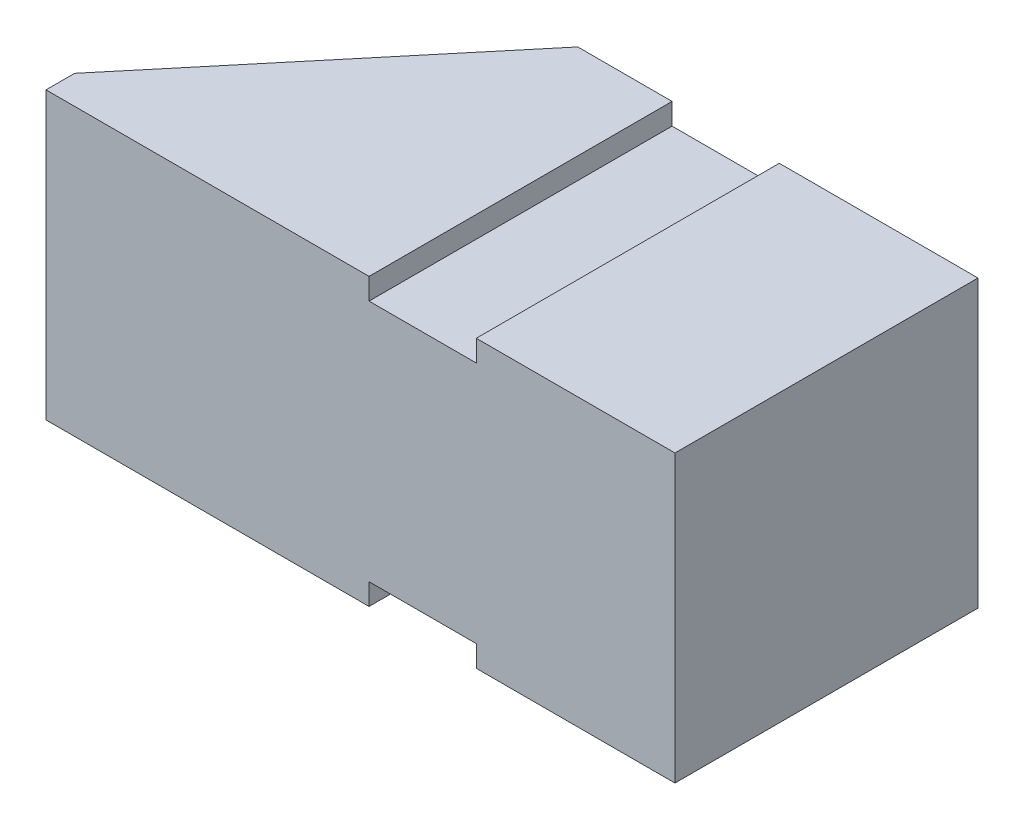
ISO-10303-21;
HEADER;
FILE_DESCRIPTION(('STEP AP214'),'2;1');
FILE_NAME('part.step','',(''),(''),'','','');
FILE_SCHEMA(('AUTOMOTIVE_DESIGN { 1 0 10303 214 1 1 1 1 }'));
ENDSEC;
DATA;
#1=APPLICATION_CONTEXT('core data for automotive mechanical design processes');
#2=APPLICATION_PROTOCOL_DEFINITION('international standard','automotive_design',2000,#1);
#3=PRODUCT_CONTEXT('',#1,'mechanical');
#4=PRODUCT('Part','Part','',(#3));
#5=PRODUCT_RELATED_PRODUCT_CATEGORY('part','',(#4));
#6=PRODUCT_DEFINITION_FORMATION('','',#4);
#7=PRODUCT_DEFINITION_CONTEXT('part definition',#1,'design');
#8=PRODUCT_DEFINITION('design','',#6,#7);
#9=PRODUCT_DEFINITION_SHAPE('','',#8);
#10=(LENGTH_UNIT() NAMED_UNIT(*) SI_UNIT(.MILLI.,.METRE.));
#11=(NAMED_UNIT(*) PLANE_ANGLE_UNIT() SI_UNIT($,.RADIAN.));
#12=(NAMED_UNIT(*) SI_UNIT($,.STERADIAN.) SOLID_ANGLE_UNIT());
#13=UNCERTAINTY_MEASURE_WITH_UNIT(LENGTH_MEASURE(1.E-05),#10,'distance_accuracy_value','');
#14=(GEOMETRIC_REPRESENTATION_CONTEXT(3) GLOBAL_UNCERTAINTY_ASSIGNED_CONTEXT((#13)) GLOBAL_UNIT_ASSIGNED_CONTEXT((#10,
#11,#12)) REPRESENTATION_CONTEXT('',''));
#15=CARTESIAN_POINT('',(0.,0.,0.));
#16=DIRECTION('',(0.,0.,1.));
#17=DIRECTION('',(1.,0.,0.));
#18=AXIS2_PLACEMENT_3D('',#15,#16,#17);
#19=CARTESIAN_POINT('',(-22.,10.,21.2));
#20=DIRECTION('',(0.,-1.,0.));
#21=DIRECTION('',(1.,0.,0.));
#22=AXIS2_PLACEMENT_3D('',#19,#20,#21);
#23=PLANE('',#22);
#24=DIRECTION('',(0.,0.,-1.));
#25=VECTOR('',#24,1.);
#26=CARTESIAN_POINT('',(8.1,10.,21.2));
#27=LINE('',#26,#25);
#28=CARTESIAN_POINT('',(8.1,10.,21.2));
#29=VERTEX_POINT('',#28);
#30=CARTESIAN_POINT('',(8.1,10.,0.));
#31=VERTEX_POINT('',#30);
#32=EDGE_CURVE('E192',#29,#31,#27,.T.);
#33=ORIENTED_EDGE('',*,*,#32,.F.);
#34=DIRECTION('',(-1.,0.,0.));
#35=VECTOR('',#34,1.);
#36=CARTESIAN_POINT('',(-22.,10.,21.2));
#37=LINE('',#36,#35);
#38=CARTESIAN_POINT('',(22.,10.,21.2));
#39=VERTEX_POINT('',#38);
#40=EDGE_CURVE('E181',#39,#29,#37,.T.);
#41=ORIENTED_EDGE('',*,*,#40,.F.);
#42=DIRECTION('',(0.,0.,-1.));
#43=VECTOR('',#42,1.);
#44=CARTESIAN_POINT('',(22.,10.,21.2));
#45=LINE('',#44,#43);
#46=CARTESIAN_POINT('',(22.,10.,0.));
#47=VERTEX_POINT('',#46);
#48=EDGE_CURVE('E270',#39,#47,#45,.T.);
#49=ORIENTED_EDGE('',*,*,#48,.T.);
#50=DIRECTION('',(-1.,0.,0.));
#51=VECTOR('',#50,1.);
#52=CARTESIAN_POINT('',(-22.,10.,0.));
#53=LINE('',#52,#51);
#54=EDGE_CURVE('E256',#47,#31,#53,.T.);
#55=ORIENTED_EDGE('',*,*,#54,.T.);
#56=EDGE_LOOP('',(#33,#41,#49,#55));
#57=FACE_BOUND('',#56,.T.);
#58=ADVANCED_FACE('F43',(#57),#23,.F.);
#59=DIRECTION('',(0.,0.,-1.));
#60=VECTOR('',#59,1.);
#61=CARTESIAN_POINT('',(0.599999999999998,10.,21.2));
#62=LINE('',#61,#60);
#63=CARTESIAN_POINT('',(0.599999999999998,10.,21.2));
#64=VERTEX_POINT('',#63);
#65=CARTESIAN_POINT('',(0.599999999999998,10.,0.));
#66=VERTEX_POINT('',#65);
#67=EDGE_CURVE('E195',#64,#66,#62,.T.);
#68=ORIENTED_EDGE('',*,*,#67,.T.);
#69=CARTESIAN_POINT('',(-6.,10.,0.));
#70=VERTEX_POINT('',#69);
#71=EDGE_CURVE('E255',#66,#70,#53,.T.);
#72=ORIENTED_EDGE('',*,*,#71,.T.);
#73=DIRECTION('',(0.64018439966448,0.,-0.768221279597376));
#74=VECTOR('',#73,1.);
#75=CARTESIAN_POINT('',(-22.983606557377,10.,20.3803278688525));
#76=LINE('',#75,#74);
#77=CARTESIAN_POINT('',(-22.,9.99999999999999,19.2));
#78=VERTEX_POINT('',#77);
#79=EDGE_CURVE('E237',#78,#70,#76,.T.);
#80=ORIENTED_EDGE('',*,*,#79,.F.);
#81=DIRECTION('',(0.,0.,-1.));
#82=VECTOR('',#81,1.);
#83=CARTESIAN_POINT('',(-22.,10.,21.2));
#84=LINE('',#83,#82);
#85=CARTESIAN_POINT('',(-22.,10.,21.2));
#86=VERTEX_POINT('',#85);
#87=EDGE_CURVE('E267',#86,#78,#84,.T.);
#88=ORIENTED_EDGE('',*,*,#87,.F.);
#89=EDGE_CURVE('E243',#64,#86,#37,.T.);
#90=ORIENTED_EDGE('',*,*,#89,.F.);
#91=EDGE_LOOP('',(#68,#72,#80,#88,#90));
#92=FACE_BOUND('',#91,.T.);
#93=ADVANCED_FACE('F320',(#92),#23,.F.);
#94=CARTESIAN_POINT('',(-22.,-10.,21.2));
#95=DIRECTION('',(0.,1.,0.));
#96=DIRECTION('',(0.,0.,1.));
#97=AXIS2_PLACEMENT_3D('',#94,#95,#96);
#98=PLANE('',#97);
#99=DIRECTION('',(1.,0.,0.));
#100=VECTOR('',#99,1.);
#101=CARTESIAN_POINT('',(-22.,-10.,21.2));
#102=LINE('',#101,#100);
#103=CARTESIAN_POINT('',(8.1,-10.,21.2));
#104=VERTEX_POINT('',#103);
#105=CARTESIAN_POINT('',(22.,-10.,21.2));
#106=VERTEX_POINT('',#105);
#107=EDGE_CURVE('E248',#104,#106,#102,.T.);
#108=ORIENTED_EDGE('',*,*,#107,.F.);
#109=DIRECTION('',(0.,0.,-1.));
#110=VECTOR('',#109,1.);
#111=CARTESIAN_POINT('',(8.1,-10.,21.2));
#112=LINE('',#111,#110);
#113=CARTESIAN_POINT('',(8.1,-10.,0.));
#114=VERTEX_POINT('',#113);
#115=EDGE_CURVE('E190',#104,#114,#112,.T.);
#116=ORIENTED_EDGE('',*,*,#115,.T.);
#117=DIRECTION('',(1.,0.,0.));
#118=VECTOR('',#117,1.);
#119=CARTESIAN_POINT('',(-22.,-10.,0.));
#120=LINE('',#119,#118);
#121=CARTESIAN_POINT('',(22.,-10.,0.));
#122=VERTEX_POINT('',#121);
#123=EDGE_CURVE('E259',#114,#122,#120,.T.);
#124=ORIENTED_EDGE('',*,*,#123,.T.);
#125=DIRECTION('',(0.,0.,-1.));
#126=VECTOR('',#125,1.);
#127=CARTESIAN_POINT('',(22.,-10.,21.2));
#128=LINE('',#127,#126);
#129=EDGE_CURVE('E252',#106,#122,#128,.T.);
#130=ORIENTED_EDGE('',*,*,#129,.F.);
#131=EDGE_LOOP('',(#108,#116,#124,#130));
#132=FACE_BOUND('',#131,.T.);
#133=ADVANCED_FACE('F326',(#132),#98,.F.);
#134=CARTESIAN_POINT('',(0.,0.,0.));
#135=DIRECTION('',(0.,0.,-1.));
#136=DIRECTION('',(-1.,0.,0.));
#137=AXIS2_PLACEMENT_3D('',#134,#135,#136);
#138=PLANE('',#137);
#139=DIRECTION('',(-1.,0.,0.));
#140=VECTOR('',#139,1.);
#141=CARTESIAN_POINT('',(0.,8.5,0.));
#142=LINE('',#141,#140);
#143=CARTESIAN_POINT('',(8.1,8.5,0.));
#144=VERTEX_POINT('',#143);
#145=CARTESIAN_POINT('',(0.599999999999998,8.5,0.));
#146=VERTEX_POINT('',#145);
#147=EDGE_CURVE('E185',#144,#146,#142,.T.);
#148=ORIENTED_EDGE('',*,*,#147,.F.);
#149=DIRECTION('',(0.,1.,0.));
#150=VECTOR('',#149,1.);
#151=CARTESIAN_POINT('',(8.09999999999999,0.,0.));
#152=LINE('',#151,#150);
#153=EDGE_CURVE('E168',#144,#31,#152,.T.);
#154=ORIENTED_EDGE('',*,*,#153,.T.);
#155=ORIENTED_EDGE('',*,*,#54,.F.);
#156=DIRECTION('',(0.,1.,0.));
#157=VECTOR('',#156,1.);
#158=CARTESIAN_POINT('',(22.,-10.,0.));
#159=LINE('',#158,#157);
#160=EDGE_CURVE('E240',#122,#47,#159,.T.);
#161=ORIENTED_EDGE('',*,*,#160,.F.);
#162=ORIENTED_EDGE('',*,*,#123,.F.);
#163=DIRECTION('',(0.,-1.,0.));
#164=VECTOR('',#163,1.);
#165=CARTESIAN_POINT('',(8.1,0.,0.));
#166=LINE('',#165,#164);
#167=CARTESIAN_POINT('',(8.1,-8.5,0.));
#168=VERTEX_POINT('',#167);
#169=EDGE_CURVE('E203',#168,#114,#166,.T.);
#170=ORIENTED_EDGE('',*,*,#169,.F.);
#171=DIRECTION('',(-1.,0.,0.));
#172=VECTOR('',#171,1.);
#173=CARTESIAN_POINT('',(0.,-8.5,0.));
#174=LINE('',#173,#172);
#175=CARTESIAN_POINT('',(0.599999999999998,-8.5,0.));
#176=VERTEX_POINT('',#175);
#177=EDGE_CURVE('E211',#168,#176,#174,.T.);
#178=ORIENTED_EDGE('',*,*,#177,.T.);
#179=DIRECTION('',(0.,1.,0.));
#180=VECTOR('',#179,1.);
#181=CARTESIAN_POINT('',(0.600000000000003,0.,0.));
#182=LINE('',#181,#180);
#183=CARTESIAN_POINT('',(0.600000000020676,-10.,0.));
#184=VERTEX_POINT('',#183);
#185=EDGE_CURVE('E209',#184,#176,#182,.T.);
#186=ORIENTED_EDGE('',*,*,#185,.F.);
#187=CARTESIAN_POINT('',(-6.,-9.99999999999999,0.));
#188=VERTEX_POINT('',#187);
#189=EDGE_CURVE('E244',#188,#184,#120,.T.);
#190=ORIENTED_EDGE('',*,*,#189,.F.);
#191=DIRECTION('',(0.,1.,0.));
#192=VECTOR('',#191,1.);
#193=CARTESIAN_POINT('',(-6.,0.,0.));
#194=LINE('',#193,#192);
#195=EDGE_CURVE('E273',#188,#70,#194,.T.);
#196=ORIENTED_EDGE('',*,*,#195,.T.);
#197=ORIENTED_EDGE('',*,*,#71,.F.);
#198=DIRECTION('',(0.,-1.,0.));
#199=VECTOR('',#198,1.);
#200=CARTESIAN_POINT('',(0.600000000000003,0.,0.));
#201=LINE('',#200,#199);
#202=EDGE_CURVE('E182',#66,#146,#201,.T.);
#203=ORIENTED_EDGE('',*,*,#202,.T.);
#204=EDGE_LOOP('',(#148,#154,#155,#161,#162,#170,#178,#186,#190,#196,#197,#203));
#205=FACE_BOUND('',#204,.T.);
#206=ADVANCED_FACE('F358',(#205),#138,.T.);
#207=CARTESIAN_POINT('',(0.,0.,21.2));
#208=DIRECTION('',(0.,0.,-1.));
#209=DIRECTION('',(-1.,0.,0.));
#210=AXIS2_PLACEMENT_3D('',#207,#208,#209);
#211=PLANE('',#210);
#212=DIRECTION('',(0.,1.,0.));
#213=VECTOR('',#212,1.);
#214=CARTESIAN_POINT('',(8.09999999999999,0.,21.2));
#215=LINE('',#214,#213);
#216=CARTESIAN_POINT('',(8.1,8.5,21.2));
#217=VERTEX_POINT('',#216);
#218=EDGE_CURVE('E165',#217,#29,#215,.T.);
#219=ORIENTED_EDGE('',*,*,#218,.F.);
#220=DIRECTION('',(-1.,0.,0.));
#221=VECTOR('',#220,1.);
#222=CARTESIAN_POINT('',(0.,8.5,21.2));
#223=LINE('',#222,#221);
#224=CARTESIAN_POINT('',(0.599999999999998,8.5,21.2));
#225=VERTEX_POINT('',#224);
#226=EDGE_CURVE('E173',#217,#225,#223,.T.);
#227=ORIENTED_EDGE('',*,*,#226,.T.);
#228=DIRECTION('',(0.,-1.,0.));
#229=VECTOR('',#228,1.);
#230=CARTESIAN_POINT('',(0.600000000000003,0.,21.2));
#231=LINE('',#230,#229);
#232=EDGE_CURVE('E170',#64,#225,#231,.T.);
#233=ORIENTED_EDGE('',*,*,#232,.F.);
#234=ORIENTED_EDGE('',*,*,#89,.T.);
#235=DIRECTION('',(0.,-1.,0.));
#236=VECTOR('',#235,1.);
#237=CARTESIAN_POINT('',(-22.,-10.,21.2));
#238=LINE('',#237,#236);
#239=CARTESIAN_POINT('',(-22.,-10.,21.2));
#240=VERTEX_POINT('',#239);
#241=EDGE_CURVE('E246',#86,#240,#238,.T.);
#242=ORIENTED_EDGE('',*,*,#241,.T.);
#243=CARTESIAN_POINT('',(0.600000000020676,-10.,21.2));
#244=VERTEX_POINT('',#243);
#245=EDGE_CURVE('E249',#240,#244,#102,.T.);
#246=ORIENTED_EDGE('',*,*,#245,.T.);
#247=DIRECTION('',(0.,1.,0.));
#248=VECTOR('',#247,1.);
#249=CARTESIAN_POINT('',(0.600000000000003,0.,21.2));
#250=LINE('',#249,#248);
#251=CARTESIAN_POINT('',(0.599999999999998,-8.5,21.2));
#252=VERTEX_POINT('',#251);
#253=EDGE_CURVE('E199',#244,#252,#250,.T.);
#254=ORIENTED_EDGE('',*,*,#253,.T.);
#255=DIRECTION('',(-1.,0.,0.));
#256=VECTOR('',#255,1.);
#257=CARTESIAN_POINT('',(0.,-8.5,21.2));
#258=LINE('',#257,#256);
#259=CARTESIAN_POINT('',(8.1,-8.5,21.2));
#260=VERTEX_POINT('',#259);
#261=EDGE_CURVE('E202',#260,#252,#258,.T.);
#262=ORIENTED_EDGE('',*,*,#261,.F.);
#263=DIRECTION('',(0.,-1.,0.));
#264=VECTOR('',#263,1.);
#265=CARTESIAN_POINT('',(8.1,0.,21.2));
#266=LINE('',#265,#264);
#267=EDGE_CURVE('E205',#260,#104,#266,.T.);
#268=ORIENTED_EDGE('',*,*,#267,.T.);
#269=ORIENTED_EDGE('',*,*,#107,.T.);
#270=DIRECTION('',(0.,1.,0.));
#271=VECTOR('',#270,1.);
#272=CARTESIAN_POINT('',(22.,-10.,21.2));
#273=LINE('',#272,#271);
#274=EDGE_CURVE('E241',#106,#39,#273,.T.);
#275=ORIENTED_EDGE('',*,*,#274,.T.);
#276=ORIENTED_EDGE('',*,*,#40,.T.);
#277=EDGE_LOOP('',(#219,#227,#233,#234,#242,#246,#254,#262,#268,#269,#275,#276));
#278=FACE_BOUND('',#277,.T.);
#279=ADVANCED_FACE('F179',(#278),#211,.F.);
#280=CARTESIAN_POINT('',(-22.,-10.,21.2));
#281=DIRECTION('',(1.,0.,0.));
#282=DIRECTION('',(0.,0.,-1.));
#283=AXIS2_PLACEMENT_3D('',#280,#281,#282);
#284=PLANE('',#283);
#285=DIRECTION('',(0.,-1.,0.));
#286=VECTOR('',#285,1.);
#287=CARTESIAN_POINT('',(-22.,80.9715847922422,19.2));
#288=LINE('',#287,#286);
#289=CARTESIAN_POINT('',(-22.,-9.99999999999999,19.2));
#290=VERTEX_POINT('',#289);
#291=EDGE_CURVE('E229',#78,#290,#288,.T.);
#292=ORIENTED_EDGE('',*,*,#291,.T.);
#293=DIRECTION('',(0.,0.,-1.));
#294=VECTOR('',#293,1.);
#295=CARTESIAN_POINT('',(-22.,-10.,21.2));
#296=LINE('',#295,#294);
#297=EDGE_CURVE('E264',#240,#290,#296,.T.);
#298=ORIENTED_EDGE('',*,*,#297,.F.);
#299=ORIENTED_EDGE('',*,*,#241,.F.);
#300=ORIENTED_EDGE('',*,*,#87,.T.);
#301=EDGE_LOOP('',(#292,#298,#299,#300));
#302=FACE_BOUND('',#301,.T.);
#303=ADVANCED_FACE('F330',(#302),#284,.F.);
#304=ORIENTED_EDGE('',*,*,#189,.T.);
#305=DIRECTION('',(0.,0.,-1.));
#306=VECTOR('',#305,1.);
#307=CARTESIAN_POINT('',(0.600000000020676,-10.,21.2));
#308=LINE('',#307,#306);
#309=EDGE_CURVE('E208',#244,#184,#308,.T.);
#310=ORIENTED_EDGE('',*,*,#309,.F.);
#311=ORIENTED_EDGE('',*,*,#245,.F.);
#312=ORIENTED_EDGE('',*,*,#297,.T.);
#313=DIRECTION('',(-0.64018439966448,0.,0.768221279597376));
#314=VECTOR('',#313,1.);
#315=CARTESIAN_POINT('',(-22.983606557377,-10.,20.3803278688525));
#316=LINE('',#315,#314);
#317=EDGE_CURVE('E235',#188,#290,#316,.T.);
#318=ORIENTED_EDGE('',*,*,#317,.F.);
#319=EDGE_LOOP('',(#304,#310,#311,#312,#318));
#320=FACE_BOUND('',#319,.T.);
#321=ADVANCED_FACE('F334',(#320),#98,.F.);
#322=CARTESIAN_POINT('',(22.,-10.,21.2));
#323=DIRECTION('',(-1.,0.,0.));
#324=DIRECTION('',(0.,0.,1.));
#325=AXIS2_PLACEMENT_3D('',#322,#323,#324);
#326=PLANE('',#325);
#327=ORIENTED_EDGE('',*,*,#160,.T.);
#328=ORIENTED_EDGE('',*,*,#48,.F.);
#329=ORIENTED_EDGE('',*,*,#274,.F.);
#330=ORIENTED_EDGE('',*,*,#129,.T.);
#331=EDGE_LOOP('',(#327,#328,#329,#330));
#332=FACE_BOUND('',#331,.T.);
#333=ADVANCED_FACE('F332',(#332),#326,.F.);
#334=CARTESIAN_POINT('',(-22.,80.9715847922422,19.2));
#335=DIRECTION('',(-0.768221279597376,0.,-0.64018439966448));
#336=DIRECTION('',(-0.64018439966448,0.,0.768221279597376));
#337=AXIS2_PLACEMENT_3D('',#334,#335,#336);
#338=PLANE('',#337);
#339=DIRECTION('',(-0.64018439966448,0.,0.768221279597376));
#340=VECTOR('',#339,1.);
#341=CARTESIAN_POINT('',(-18.4835957934574,8.2,14.9803149521488));
#342=LINE('',#341,#340);
#343=CARTESIAN_POINT('',(-7.15233191939606,8.2,1.38279830327528));
#344=VERTEX_POINT('',#343);
#345=CARTESIAN_POINT('',(-18.4835957934574,8.2,14.9803149521488));
#346=VERTEX_POINT('',#345);
#347=EDGE_CURVE('E280',#344,#346,#342,.T.);
#348=ORIENTED_EDGE('',*,*,#347,.T.);
#349=DIRECTION('',(0.,1.,0.));
#350=VECTOR('',#349,1.);
#351=CARTESIAN_POINT('',(-18.4835957934574,-7.49999999999999,14.9803149521488));
#352=LINE('',#351,#350);
#353=CARTESIAN_POINT('',(-18.4835957934574,-8.2,14.9803149521488));
#354=VERTEX_POINT('',#353);
#355=EDGE_CURVE('E224',#354,#346,#352,.T.);
#356=ORIENTED_EDGE('',*,*,#355,.F.);
#357=DIRECTION('',(0.64018439966448,0.,-0.768221279597376));
#358=VECTOR('',#357,1.);
#359=CARTESIAN_POINT('',(-7.60046099916119,-8.2,1.92055319899344));
#360=LINE('',#359,#358);
#361=CARTESIAN_POINT('',(-7.15233191939607,-8.2,1.38279830327528));
#362=VERTEX_POINT('',#361);
#363=EDGE_CURVE('E278',#354,#362,#360,.T.);
#364=ORIENTED_EDGE('',*,*,#363,.T.);
#365=DIRECTION('',(0.,1.,0.));
#366=VECTOR('',#365,1.);
#367=CARTESIAN_POINT('',(-7.15233191939606,7.49999999999999,1.38279830327528));
#368=LINE('',#367,#366);
#369=EDGE_CURVE('E276',#362,#344,#368,.T.);
#370=ORIENTED_EDGE('',*,*,#369,.T.);
#371=EDGE_LOOP('',(#348,#356,#364,#370));
#372=FACE_BOUND('',#371,.T.);
#373=ORIENTED_EDGE('',*,*,#291,.F.);
#374=ORIENTED_EDGE('',*,*,#79,.T.);
#375=ORIENTED_EDGE('',*,*,#195,.F.);
#376=ORIENTED_EDGE('',*,*,#317,.T.);
#377=EDGE_LOOP('',(#373,#374,#375,#376));
#378=FACE_BOUND('',#377,.T.);
#379=ADVANCED_FACE('F297',(#372,#378),#338,.T.);
#380=CARTESIAN_POINT('',(-3.00322871083922,0.,-2.50269059236601));
#381=DIRECTION('',(0.768221279597376,0.,0.64018439966448));
#382=DIRECTION('',(0.64018439966448,0.,-0.768221279597376));
#383=AXIS2_PLACEMENT_3D('',#380,#381,#382);
#384=PLANE('',#383);
#385=DIRECTION('',(-0.64018439966448,0.,0.768221279597376));
#386=VECTOR('',#385,1.);
#387=CARTESIAN_POINT('',(-7.06270610344304,-7.49999999999999,2.36868227875857));
#388=LINE('',#387,#386);
#389=CARTESIAN_POINT('',(-7.06270610344304,-7.49999999999999,2.36868227875857));
#390=VERTEX_POINT('',#389);
#391=CARTESIAN_POINT('',(-17.4977118179741,-7.49999999999999,14.8906891361958));
#392=VERTEX_POINT('',#391);
#393=EDGE_CURVE('E223',#390,#392,#388,.T.);
#394=ORIENTED_EDGE('',*,*,#393,.T.);
#395=DIRECTION('',(0.,1.,0.));
#396=VECTOR('',#395,1.);
#397=CARTESIAN_POINT('',(-17.4977118179741,7.49999999999999,14.8906891361958));
#398=LINE('',#397,#396);
#399=CARTESIAN_POINT('',(-17.4977118179741,7.49999999999999,14.8906891361958));
#400=VERTEX_POINT('',#399);
#401=EDGE_CURVE('E283',#392,#400,#398,.T.);
#402=ORIENTED_EDGE('',*,*,#401,.T.);
#403=DIRECTION('',(0.64018439966448,0.,-0.768221279597376));
#404=VECTOR('',#403,1.);
#405=CARTESIAN_POINT('',(-7.06270610344304,7.49999999999999,2.36868227875857));
#406=LINE('',#405,#404);
#407=CARTESIAN_POINT('',(-7.06270610344304,7.49999999999999,2.36868227875857));
#408=VERTEX_POINT('',#407);
#409=EDGE_CURVE('E227',#400,#408,#406,.T.);
#410=ORIENTED_EDGE('',*,*,#409,.T.);
#411=DIRECTION('',(0.,-1.,0.));
#412=VECTOR('',#411,1.);
#413=CARTESIAN_POINT('',(-7.06270610344304,-7.49999999999999,2.36868227875857));
#414=LINE('',#413,#412);
#415=EDGE_CURVE('E221',#408,#390,#414,.T.);
#416=ORIENTED_EDGE('',*,*,#415,.T.);
#417=EDGE_LOOP('',(#394,#402,#410,#416));
#418=FACE_BOUND('',#417,.T.);
#419=ADVANCED_FACE('F307',(#418),#384,.F.);
#420=CARTESIAN_POINT('',(-7.06270610344304,-7.49999999999999,2.36868227875857));
#421=DIRECTION('',(-0.543214476255114,0.707106781186544,-0.452678730212595));
#422=DIRECTION('',(0.64018439966448,0.,-0.768221279597376));
#423=AXIS2_PLACEMENT_3D('',#420,#421,#422);
#424=PLANE('',#423);
#425=ORIENTED_EDGE('',*,*,#363,.F.);
#426=DIRECTION('',(-0.813143398050028,-0.577350269189628,0.0739221270954596));
#427=VECTOR('',#426,1.);
#428=CARTESIAN_POINT('',(-9.84537429398466,-2.06666666666664,14.1950220885604));
#429=LINE('',#428,#427);
#430=EDGE_CURVE('E11',#354,#392,#429,.F.);
#431=ORIENTED_EDGE('',*,*,#430,.T.);
#432=ORIENTED_EDGE('',*,*,#393,.F.);
#433=DIRECTION('',(0.073922127095456,0.577350269189629,0.813143398050028));
#434=VECTOR('',#433,1.);
#435=CARTESIAN_POINT('',(-7.06270610344304,-7.49999999999999,2.36868227875857));
#436=LINE('',#435,#434);
#437=EDGE_CURVE('E232',#362,#390,#436,.T.);
#438=ORIENTED_EDGE('',*,*,#437,.F.);
#439=EDGE_LOOP('',(#425,#431,#432,#438));
#440=FACE_BOUND('',#439,.T.);
#441=ADVANCED_FACE('F304',(#440),#424,.T.);
#442=CARTESIAN_POINT('',(-7.06270610344304,-7.49999999999999,2.36868227875857));
#443=DIRECTION('',(-0.995893206467704,0.,0.0905357460425172));
#444=DIRECTION('',(0.,1.,0.));
#445=AXIS2_PLACEMENT_3D('',#442,#443,#444);
#446=PLANE('',#445);
#447=ORIENTED_EDGE('',*,*,#437,.T.);
#448=ORIENTED_EDGE('',*,*,#415,.F.);
#449=DIRECTION('',(-0.073922127095456,0.577350269189629,-0.813143398050028));
#450=VECTOR('',#449,1.);
#451=CARTESIAN_POINT('',(-7.06270610344304,7.49999999999999,2.36868227875857));
#452=LINE('',#451,#450);
#453=EDGE_CURVE('E194',#344,#408,#452,.F.);
#454=ORIENTED_EDGE('',*,*,#453,.F.);
#455=ORIENTED_EDGE('',*,*,#369,.F.);
#456=EDGE_LOOP('',(#447,#448,#454,#455));
#457=FACE_BOUND('',#456,.T.);
#458=ADVANCED_FACE('F310',(#457),#446,.T.);
#459=CARTESIAN_POINT('',(-7.06270610344304,7.49999999999999,2.36868227875857));
#460=DIRECTION('',(-0.543214476255114,-0.707106781186544,-0.452678730212595));
#461=DIRECTION('',(-0.64018439966448,0.,0.768221279597376));
#462=AXIS2_PLACEMENT_3D('',#459,#460,#461);
#463=PLANE('',#462);
#464=ORIENTED_EDGE('',*,*,#409,.F.);
#465=DIRECTION('',(0.813143398050028,-0.577350269189628,-0.0739221270954596));
#466=VECTOR('',#465,1.);
#467=CARTESIAN_POINT('',(-9.84537429398466,2.06666666666664,14.1950220885604));
#468=LINE('',#467,#466);
#469=EDGE_CURVE('E52',#400,#346,#468,.F.);
#470=ORIENTED_EDGE('',*,*,#469,.T.);
#471=ORIENTED_EDGE('',*,*,#347,.F.);
#472=ORIENTED_EDGE('',*,*,#453,.T.);
#473=EDGE_LOOP('',(#464,#470,#471,#472));
#474=FACE_BOUND('',#473,.T.);
#475=ADVANCED_FACE('F292',(#474),#463,.T.);
#476=CARTESIAN_POINT('',(-17.4977118179741,0.,14.8906891361958));
#477=DIRECTION('',(-0.0905357460425215,0.,-0.995893206467704));
#478=DIRECTION('',(0.,-1.,0.));
#479=AXIS2_PLACEMENT_3D('',#476,#477,#478);
#480=PLANE('',#479);
#481=ORIENTED_EDGE('',*,*,#430,.F.);
#482=ORIENTED_EDGE('',*,*,#355,.T.);
#483=ORIENTED_EDGE('',*,*,#469,.F.);
#484=ORIENTED_EDGE('',*,*,#401,.F.);
#485=EDGE_LOOP('',(#481,#482,#483,#484));
#486=FACE_BOUND('',#485,.T.);
#487=ADVANCED_FACE('F46',(#486),#480,.T.);
#488=CARTESIAN_POINT('',(8.1,0.,21.2));
#489=DIRECTION('',(1.,0.,0.));
#490=DIRECTION('',(0.,0.,-1.));
#491=AXIS2_PLACEMENT_3D('',#488,#489,#490);
#492=PLANE('',#491);
#493=ORIENTED_EDGE('',*,*,#169,.T.);
#494=ORIENTED_EDGE('',*,*,#115,.F.);
#495=ORIENTED_EDGE('',*,*,#267,.F.);
#496=DIRECTION('',(0.,0.,-1.));
#497=VECTOR('',#496,1.);
#498=CARTESIAN_POINT('',(8.1,-8.5,21.2));
#499=LINE('',#498,#497);
#500=EDGE_CURVE('E217',#260,#168,#499,.T.);
#501=ORIENTED_EDGE('',*,*,#500,.T.);
#502=EDGE_LOOP('',(#493,#494,#495,#501));
#503=FACE_BOUND('',#502,.T.);
#504=ADVANCED_FACE('F365',(#503),#492,.F.);
#505=CARTESIAN_POINT('',(0.,-8.5,21.2));
#506=DIRECTION('',(0.,-1.,0.));
#507=DIRECTION('',(0.,0.,-1.));
#508=AXIS2_PLACEMENT_3D('',#505,#506,#507);
#509=PLANE('',#508);
#510=ORIENTED_EDGE('',*,*,#177,.F.);
#511=ORIENTED_EDGE('',*,*,#500,.F.);
#512=ORIENTED_EDGE('',*,*,#261,.T.);
#513=DIRECTION('',(0.,0.,-1.));
#514=VECTOR('',#513,1.);
#515=CARTESIAN_POINT('',(0.599999999999998,-8.5,21.2));
#516=LINE('',#515,#514);
#517=EDGE_CURVE('E67',#252,#176,#516,.T.);
#518=ORIENTED_EDGE('',*,*,#517,.T.);
#519=EDGE_LOOP('',(#510,#511,#512,#518));
#520=FACE_BOUND('',#519,.T.);
#521=ADVANCED_FACE('F370',(#520),#509,.T.);
#522=CARTESIAN_POINT('',(0.600000000000003,0.,21.2));
#523=DIRECTION('',(-1.,0.,0.));
#524=DIRECTION('',(0.,-1.,0.));
#525=AXIS2_PLACEMENT_3D('',#522,#523,#524);
#526=PLANE('',#525);
#527=ORIENTED_EDGE('',*,*,#185,.T.);
#528=ORIENTED_EDGE('',*,*,#517,.F.);
#529=ORIENTED_EDGE('',*,*,#253,.F.);
#530=ORIENTED_EDGE('',*,*,#309,.T.);
#531=EDGE_LOOP('',(#527,#528,#529,#530));
#532=FACE_BOUND('',#531,.T.);
#533=ADVANCED_FACE('F371',(#532),#526,.F.);
#534=CARTESIAN_POINT('',(8.09999999999999,0.,21.2));
#535=DIRECTION('',(-1.,0.,0.));
#536=DIRECTION('',(0.,-1.,0.));
#537=AXIS2_PLACEMENT_3D('',#534,#535,#536);
#538=PLANE('',#537);
#539=ORIENTED_EDGE('',*,*,#153,.F.);
#540=DIRECTION('',(0.,0.,-1.));
#541=VECTOR('',#540,1.);
#542=CARTESIAN_POINT('',(8.1,8.5,21.2));
#543=LINE('',#542,#541);
#544=EDGE_CURVE('E162',#217,#144,#543,.T.);
#545=ORIENTED_EDGE('',*,*,#544,.F.);
#546=ORIENTED_EDGE('',*,*,#218,.T.);
#547=ORIENTED_EDGE('',*,*,#32,.T.);
#548=EDGE_LOOP('',(#539,#545,#546,#547));
#549=FACE_BOUND('',#548,.T.);
#550=ADVANCED_FACE('F163',(#549),#538,.T.);
#551=CARTESIAN_POINT('',(0.600000000000003,0.,21.2));
#552=DIRECTION('',(1.,0.,0.));
#553=DIRECTION('',(0.,1.,0.));
#554=AXIS2_PLACEMENT_3D('',#551,#552,#553);
#555=PLANE('',#554);
#556=ORIENTED_EDGE('',*,*,#202,.F.);
#557=ORIENTED_EDGE('',*,*,#67,.F.);
#558=ORIENTED_EDGE('',*,*,#232,.T.);
#559=DIRECTION('',(0.,0.,-1.));
#560=VECTOR('',#559,1.);
#561=CARTESIAN_POINT('',(0.599999999999998,8.5,21.2));
#562=LINE('',#561,#560);
#563=EDGE_CURVE('E59',#225,#146,#562,.T.);
#564=ORIENTED_EDGE('',*,*,#563,.T.);
#565=EDGE_LOOP('',(#556,#557,#558,#564));
#566=FACE_BOUND('',#565,.T.);
#567=ADVANCED_FACE('F383',(#566),#555,.T.);
#568=CARTESIAN_POINT('',(0.,8.5,21.2));
#569=DIRECTION('',(0.,-1.,0.));
#570=DIRECTION('',(0.,0.,-1.));
#571=AXIS2_PLACEMENT_3D('',#568,#569,#570);
#572=PLANE('',#571);
#573=ORIENTED_EDGE('',*,*,#147,.T.);
#574=ORIENTED_EDGE('',*,*,#563,.F.);
#575=ORIENTED_EDGE('',*,*,#226,.F.);
#576=ORIENTED_EDGE('',*,*,#544,.T.);
#577=EDGE_LOOP('',(#573,#574,#575,#576));
#578=FACE_BOUND('',#577,.T.);
#579=ADVANCED_FACE('F174',(#578),#572,.F.);
#580=CLOSED_SHELL('',(#58,#93,#133,#206,#279,#303,#321,#333,#379,#419,#441,#458,#475,#487,#504,
#521,#533,#550,#567,#579));
#581=MANIFOLD_SOLID_BREP('B2',#580);
#582=ADVANCED_BREP_SHAPE_REPRESENTATION('',(#18,#581),#14);
#583=SHAPE_DEFINITION_REPRESENTATION(#9,#582);
ENDSEC;
END-ISO-10303-21;
